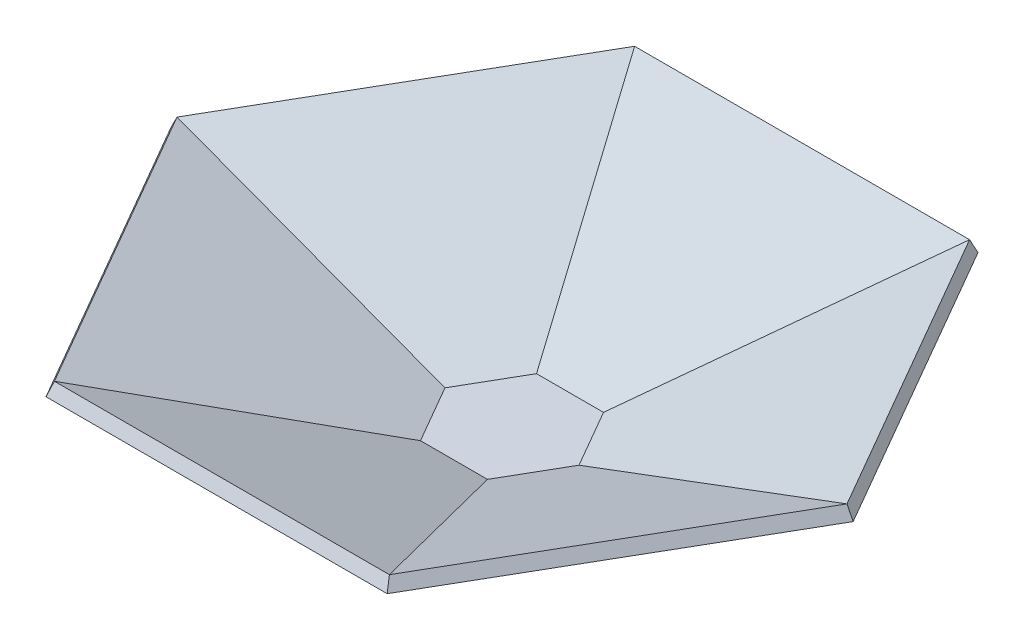
ISO-10303-21;
HEADER;
FILE_DESCRIPTION(('STEP AP214'),'2;1');
FILE_NAME('part.step','',(''),(''),'','','');
FILE_SCHEMA(('AUTOMOTIVE_DESIGN { 1 0 10303 214 1 1 1 1 }'));
ENDSEC;
DATA;
#1=APPLICATION_CONTEXT('core data for automotive mechanical design processes');
#2=APPLICATION_PROTOCOL_DEFINITION('international standard','automotive_design',2000,#1);
#3=PRODUCT_CONTEXT('',#1,'mechanical');
#4=PRODUCT('Part','Part','',(#3));
#5=PRODUCT_RELATED_PRODUCT_CATEGORY('part','',(#4));
#6=PRODUCT_DEFINITION_FORMATION('','',#4);
#7=PRODUCT_DEFINITION_CONTEXT('part definition',#1,'design');
#8=PRODUCT_DEFINITION('design','',#6,#7);
#9=PRODUCT_DEFINITION_SHAPE('','',#8);
#10=(LENGTH_UNIT() NAMED_UNIT(*) SI_UNIT(.MILLI.,.METRE.));
#11=(NAMED_UNIT(*) PLANE_ANGLE_UNIT() SI_UNIT($,.RADIAN.));
#12=(NAMED_UNIT(*) SI_UNIT($,.STERADIAN.) SOLID_ANGLE_UNIT());
#13=UNCERTAINTY_MEASURE_WITH_UNIT(LENGTH_MEASURE(1.E-05),#10,'distance_accuracy_value','');
#14=(GEOMETRIC_REPRESENTATION_CONTEXT(3) GLOBAL_UNCERTAINTY_ASSIGNED_CONTEXT((#13)) GLOBAL_UNIT_ASSIGNED_CONTEXT((#10,
#11,#12)) REPRESENTATION_CONTEXT('',''));
#15=CARTESIAN_POINT('',(0.,0.,0.));
#16=DIRECTION('',(0.,0.,1.));
#17=DIRECTION('',(1.,0.,0.));
#18=AXIS2_PLACEMENT_3D('',#15,#16,#17);
#19=CARTESIAN_POINT('',(-25.0000000000002,15.,-43.3012701892218));
#20=DIRECTION('',(-0.794719414239029,0.397359707119514,-0.458831467741119));
#21=DIRECTION('',(-0.499999999999995,0.,0.866025403784441));
#22=AXIS2_PLACEMENT_3D('',#19,#20,#21);
#23=PLANE('',#22);
#24=DIRECTION('',(-0.447213595499961,-0.894427190999914,0.));
#25=VECTOR('',#24,1.);
#26=CARTESIAN_POINT('',(-50.,15.,3.46944695195361E-13));
#27=LINE('',#26,#25);
#28=CARTESIAN_POINT('',(-50.,15.,3.46944695195361E-13));
#29=VERTEX_POINT('',#28);
#30=CARTESIAN_POINT('',(-50.9176629354823,13.1646741290355,3.56700427543127E-13));
#31=VERTEX_POINT('',#30);
#32=EDGE_CURVE('E11',#29,#31,#27,.T.);
#33=ORIENTED_EDGE('',*,*,#32,.F.);
#34=DIRECTION('',(-0.499999999999995,0.,0.866025403784441));
#35=VECTOR('',#34,1.);
#36=CARTESIAN_POINT('',(-25.0000000000002,15.,-43.3012701892218));
#37=LINE('',#36,#35);
#38=CARTESIAN_POINT('',(-25.0000000000002,15.,-43.3012701892218));
#39=VERTEX_POINT('',#38);
#40=EDGE_CURVE('E236',#39,#29,#37,.T.);
#41=ORIENTED_EDGE('',*,*,#40,.F.);
#42=DIRECTION('',(-0.223606797749995,-0.894427190999898,-0.387298334620774));
#43=VECTOR('',#42,1.);
#44=CARTESIAN_POINT('',(-25.0000000000002,15.,-43.3012701892218));
#45=LINE('',#44,#43);
#46=CARTESIAN_POINT('',(-25.4588314677414,13.1646741290355,-44.0959896034609));
#47=VERTEX_POINT('',#46);
#48=EDGE_CURVE('E48',#39,#47,#45,.T.);
#49=ORIENTED_EDGE('',*,*,#48,.T.);
#50=DIRECTION('',(-0.499999999999995,0.,0.866025403784441));
#51=VECTOR('',#50,1.);
#52=CARTESIAN_POINT('',(-25.6882472016119,13.1646741290355,-43.6986298963413));
#53=LINE('',#52,#51);
#54=EDGE_CURVE('E190',#47,#31,#53,.T.);
#55=ORIENTED_EDGE('',*,*,#54,.T.);
#56=EDGE_LOOP('',(#33,#41,#49,#55));
#57=FACE_BOUND('',#56,.T.);
#58=ADVANCED_FACE('F38',(#57),#23,.T.);
#59=CARTESIAN_POINT('',(24.9999999999999,15.,-43.301270189222));
#60=DIRECTION('',(0.,0.397359707119514,-0.917662935482247));
#61=DIRECTION('',(-1.,0.,0.));
#62=AXIS2_PLACEMENT_3D('',#59,#60,#61);
#63=PLANE('',#62);
#64=ORIENTED_EDGE('',*,*,#48,.F.);
#65=DIRECTION('',(-1.,0.,0.));
#66=VECTOR('',#65,1.);
#67=CARTESIAN_POINT('',(24.9999999999999,15.,-43.301270189222));
#68=LINE('',#67,#66);
#69=CARTESIAN_POINT('',(24.9999999999999,15.,-43.301270189222));
#70=VERTEX_POINT('',#69);
#71=EDGE_CURVE('E140',#70,#39,#68,.T.);
#72=ORIENTED_EDGE('',*,*,#71,.F.);
#73=DIRECTION('',(0.223606797749979,-0.894427190999915,-0.387298334620744));
#74=VECTOR('',#73,1.);
#75=CARTESIAN_POINT('',(24.9999999999999,15.,-43.301270189222));
#76=LINE('',#75,#74);
#77=CARTESIAN_POINT('',(25.458831467741,13.1646741290355,-44.095989603461));
#78=VERTEX_POINT('',#77);
#79=EDGE_CURVE('E134',#70,#78,#76,.T.);
#80=ORIENTED_EDGE('',*,*,#79,.T.);
#81=DIRECTION('',(1.,0.,0.));
#82=VECTOR('',#81,1.);
#83=CARTESIAN_POINT('',(0.,13.1646741290355,-44.095989603461));
#84=LINE('',#83,#82);
#85=EDGE_CURVE('E137',#78,#47,#84,.F.);
#86=ORIENTED_EDGE('',*,*,#85,.T.);
#87=EDGE_LOOP('',(#64,#72,#80,#86));
#88=FACE_BOUND('',#87,.T.);
#89=ADVANCED_FACE('F136',(#88),#63,.T.);
#90=CARTESIAN_POINT('',(50.,15.,0.));
#91=DIRECTION('',(0.794719414239026,0.397359707119513,-0.458831467741124));
#92=DIRECTION('',(-0.500000000000001,0.,-0.866025403784438));
#93=AXIS2_PLACEMENT_3D('',#90,#91,#92);
#94=PLANE('',#93);
#95=ORIENTED_EDGE('',*,*,#79,.F.);
#96=DIRECTION('',(-0.500000000000001,0.,-0.866025403784438));
#97=VECTOR('',#96,1.);
#98=CARTESIAN_POINT('',(50.,15.,0.));
#99=LINE('',#98,#97);
#100=CARTESIAN_POINT('',(50.,15.,0.));
#101=VERTEX_POINT('',#100);
#102=EDGE_CURVE('E225',#101,#70,#99,.T.);
#103=ORIENTED_EDGE('',*,*,#102,.F.);
#104=DIRECTION('',(0.447213595499958,-0.894427190999916,0.));
#105=VECTOR('',#104,1.);
#106=CARTESIAN_POINT('',(50.,15.,0.));
#107=LINE('',#106,#105);
#108=CARTESIAN_POINT('',(50.9176629354823,13.1646741290355,0.));
#109=VERTEX_POINT('',#108);
#110=EDGE_CURVE('E145',#101,#109,#107,.T.);
#111=ORIENTED_EDGE('',*,*,#110,.T.);
#112=DIRECTION('',(-0.500000000000001,0.,-0.866025403784438));
#113=VECTOR('',#112,1.);
#114=CARTESIAN_POINT('',(50.6882472016117,13.1646741290355,-0.397359707119514));
#115=LINE('',#114,#113);
#116=EDGE_CURVE('E159',#109,#78,#115,.T.);
#117=ORIENTED_EDGE('',*,*,#116,.T.);
#118=EDGE_LOOP('',(#95,#103,#111,#117));
#119=FACE_BOUND('',#118,.T.);
#120=ADVANCED_FACE('F160',(#119),#94,.T.);
#121=CARTESIAN_POINT('',(25.0000000000005,15.,43.3012701892216));
#122=DIRECTION('',(0.79471941423903,0.397359707119512,0.458831467741119));
#123=DIRECTION('',(0.499999999999995,0.,-0.866025403784442));
#124=AXIS2_PLACEMENT_3D('',#121,#122,#123);
#125=PLANE('',#124);
#126=ORIENTED_EDGE('',*,*,#110,.F.);
#127=DIRECTION('',(0.499999999999995,0.,-0.866025403784442));
#128=VECTOR('',#127,1.);
#129=CARTESIAN_POINT('',(25.0000000000005,15.,43.3012701892216));
#130=LINE('',#129,#128);
#131=CARTESIAN_POINT('',(25.0000000000005,15.,43.3012701892216));
#132=VERTEX_POINT('',#131);
#133=EDGE_CURVE('E216',#132,#101,#130,.T.);
#134=ORIENTED_EDGE('',*,*,#133,.F.);
#135=DIRECTION('',(0.223606797750047,-0.894427190999855,0.387298334620844));
#136=VECTOR('',#135,1.);
#137=CARTESIAN_POINT('',(25.0000000000005,15.,43.3012701892216));
#138=LINE('',#137,#136);
#139=CARTESIAN_POINT('',(25.4588314677418,13.1646741290356,44.0959896034609));
#140=VERTEX_POINT('',#139);
#141=EDGE_CURVE('E240',#132,#140,#138,.T.);
#142=ORIENTED_EDGE('',*,*,#141,.T.);
#143=DIRECTION('',(0.499999999999995,0.,-0.866025403784442));
#144=VECTOR('',#143,1.);
#145=CARTESIAN_POINT('',(25.6882472016122,13.1646741290355,43.6986298963412));
#146=LINE('',#145,#144);
#147=EDGE_CURVE('E171',#140,#109,#146,.T.);
#148=ORIENTED_EDGE('',*,*,#147,.T.);
#149=EDGE_LOOP('',(#126,#134,#142,#148));
#150=FACE_BOUND('',#149,.T.);
#151=ADVANCED_FACE('F259',(#150),#125,.T.);
#152=CARTESIAN_POINT('',(-24.9999999999996,15.,43.3012701892222));
#153=DIRECTION('',(0.,0.397359707119514,0.917662935482247));
#154=DIRECTION('',(1.,0.,0.));
#155=AXIS2_PLACEMENT_3D('',#152,#153,#154);
#156=PLANE('',#155);
#157=ORIENTED_EDGE('',*,*,#141,.F.);
#158=DIRECTION('',(1.,0.,0.));
#159=VECTOR('',#158,1.);
#160=CARTESIAN_POINT('',(-24.9999999999996,15.,43.3012701892222));
#161=LINE('',#160,#159);
#162=CARTESIAN_POINT('',(-24.9999999999996,15.,43.3012701892222));
#163=VERTEX_POINT('',#162);
#164=EDGE_CURVE('E201',#163,#132,#161,.T.);
#165=ORIENTED_EDGE('',*,*,#164,.F.);
#166=DIRECTION('',(-0.223606797749981,-0.894427190999916,0.387298334620741));
#167=VECTOR('',#166,1.);
#168=CARTESIAN_POINT('',(-24.9999999999996,15.,43.3012701892222));
#169=LINE('',#168,#167);
#170=CARTESIAN_POINT('',(-25.4588314677407,13.1646741290355,44.0959896034612));
#171=VERTEX_POINT('',#170);
#172=EDGE_CURVE('E42',#163,#171,#169,.T.);
#173=ORIENTED_EDGE('',*,*,#172,.T.);
#174=DIRECTION('',(1.,0.,0.));
#175=VECTOR('',#174,1.);
#176=CARTESIAN_POINT('',(0.,13.1646741290356,44.0959896034612));
#177=LINE('',#176,#175);
#178=EDGE_CURVE('E184',#171,#140,#177,.T.);
#179=ORIENTED_EDGE('',*,*,#178,.T.);
#180=EDGE_LOOP('',(#157,#165,#173,#179));
#181=FACE_BOUND('',#180,.T.);
#182=ADVANCED_FACE('F284',(#181),#156,.T.);
#183=CARTESIAN_POINT('',(-50.,15.,3.49148133884313E-13));
#184=DIRECTION('',(-0.794719414239022,0.397359707119514,0.45883146774113));
#185=DIRECTION('',(0.500000000000007,0.,0.866025403784435));
#186=AXIS2_PLACEMENT_3D('',#183,#184,#185);
#187=PLANE('',#186);
#188=DIRECTION('',(0.500000000000007,0.,0.866025403784435));
#189=VECTOR('',#188,1.);
#190=CARTESIAN_POINT('',(-50.,15.,3.49148133884313E-13));
#191=LINE('',#190,#189);
#192=EDGE_CURVE('E197',#29,#163,#191,.T.);
#193=ORIENTED_EDGE('',*,*,#192,.F.);
#194=ORIENTED_EDGE('',*,*,#32,.T.);
#195=DIRECTION('',(0.500000000000007,0.,0.866025403784435));
#196=VECTOR('',#195,1.);
#197=CARTESIAN_POINT('',(-50.6882472016117,13.1646741290355,0.397359707119869));
#198=LINE('',#197,#196);
#199=EDGE_CURVE('E192',#31,#171,#198,.T.);
#200=ORIENTED_EDGE('',*,*,#199,.T.);
#201=ORIENTED_EDGE('',*,*,#172,.F.);
#202=EDGE_LOOP('',(#193,#194,#200,#201));
#203=FACE_BOUND('',#202,.T.);
#204=ADVANCED_FACE('F40',(#203),#187,.T.);
#205=CARTESIAN_POINT('',(0.,-4.99322060780662,2.16212794653026));
#206=DIRECTION('',(0.,0.917662935482247,-0.397359707119514));
#207=DIRECTION('',(0.,0.397359707119514,0.917662935482247));
#208=AXIS2_PLACEMENT_3D('',#205,#206,#207);
#209=PLANE('',#208);
#210=DIRECTION('',(0.468164588784533,0.351123441588392,0.810884854079377));
#211=VECTOR('',#210,1.);
#212=CARTESIAN_POINT('',(0.974704022756725,-5.19842145470277,1.68823688975652));
#213=LINE('',#212,#211);
#214=CARTESIAN_POINT('',(5.23926596236052,-2.,9.07467484117455));
#215=VERTEX_POINT('',#214);
#216=EDGE_CURVE('E188',#215,#140,#213,.T.);
#217=ORIENTED_EDGE('',*,*,#216,.T.);
#218=ORIENTED_EDGE('',*,*,#178,.F.);
#219=DIRECTION('',(-0.468164588784515,0.351123441588392,0.810884854079387));
#220=VECTOR('',#219,1.);
#221=CARTESIAN_POINT('',(-0.974704022756751,-5.19842145470278,1.68823688975652));
#222=LINE('',#221,#220);
#223=CARTESIAN_POINT('',(-5.23926596236039,-2.,9.07467484117465));
#224=VERTEX_POINT('',#223);
#225=EDGE_CURVE('E187',#224,#171,#222,.T.);
#226=ORIENTED_EDGE('',*,*,#225,.F.);
#227=DIRECTION('',(1.,0.,0.));
#228=VECTOR('',#227,1.);
#229=CARTESIAN_POINT('',(0.,-2.,9.0746748411746));
#230=LINE('',#229,#228);
#231=EDGE_CURVE('E112',#224,#215,#230,.T.);
#232=ORIENTED_EDGE('',*,*,#231,.T.);
#233=EDGE_LOOP('',(#217,#218,#226,#232));
#234=FACE_BOUND('',#233,.T.);
#235=ADVANCED_FACE('F268',(#234),#209,.F.);
#236=CARTESIAN_POINT('',(-1.87245772792748,-4.99322060780662,1.08106397326514));
#237=DIRECTION('',(0.344123600805842,0.917662935482247,-0.19867985355976));
#238=DIRECTION('',(-0.936329177569045,0.351123441588391,0.));
#239=AXIS2_PLACEMENT_3D('',#236,#237,#238);
#240=PLANE('',#239);
#241=ORIENTED_EDGE('',*,*,#225,.T.);
#242=ORIENTED_EDGE('',*,*,#199,.F.);
#243=DIRECTION('',(-0.936329177569044,0.351123441588392,0.));
#244=VECTOR('',#243,1.);
#245=CARTESIAN_POINT('',(-1.94940804551354,-5.19842145470278,0.));
#246=LINE('',#245,#244);
#247=CARTESIAN_POINT('',(-10.4785319247209,-2.,1.00911673563117E-13));
#248=VERTEX_POINT('',#247);
#249=EDGE_CURVE('E178',#248,#31,#246,.T.);
#250=ORIENTED_EDGE('',*,*,#249,.F.);
#251=DIRECTION('',(0.500000000000007,0.,0.866025403784435));
#252=VECTOR('',#251,1.);
#253=CARTESIAN_POINT('',(-7.85889894354068,-2.,4.53733742058736));
#254=LINE('',#253,#252);
#255=EDGE_CURVE('E182',#248,#224,#254,.T.);
#256=ORIENTED_EDGE('',*,*,#255,.T.);
#257=EDGE_LOOP('',(#241,#242,#250,#256));
#258=FACE_BOUND('',#257,.T.);
#259=ADVANCED_FACE('F278',(#258),#240,.F.);
#260=CARTESIAN_POINT('',(1.87245772792748,-4.9932206078066,1.08106397326511));
#261=DIRECTION('',(-0.344123600805843,0.917662935482248,-0.198679853559754));
#262=DIRECTION('',(-0.936329177569045,-0.351123441588392,0.));
#263=AXIS2_PLACEMENT_3D('',#260,#261,#262);
#264=PLANE('',#263);
#265=DIRECTION('',(0.936329177569045,0.351123441588392,0.));
#266=VECTOR('',#265,1.);
#267=CARTESIAN_POINT('',(1.94940804551354,-5.19842145470276,0.));
#268=LINE('',#267,#266);
#269=CARTESIAN_POINT('',(10.4785319247209,-2.,0.));
#270=VERTEX_POINT('',#269);
#271=EDGE_CURVE('E179',#270,#109,#268,.T.);
#272=ORIENTED_EDGE('',*,*,#271,.T.);
#273=ORIENTED_EDGE('',*,*,#147,.F.);
#274=ORIENTED_EDGE('',*,*,#216,.F.);
#275=DIRECTION('',(0.499999999999995,0.,-0.866025403784442));
#276=VECTOR('',#275,1.);
#277=CARTESIAN_POINT('',(7.85889894354072,-2.,4.53733742058724));
#278=LINE('',#277,#276);
#279=EDGE_CURVE('E168',#215,#270,#278,.T.);
#280=ORIENTED_EDGE('',*,*,#279,.T.);
#281=EDGE_LOOP('',(#272,#273,#274,#280));
#282=FACE_BOUND('',#281,.T.);
#283=ADVANCED_FACE('F263',(#282),#264,.F.);
#284=CARTESIAN_POINT('',(1.87245772792748,-4.99322060780661,-1.08106397326513));
#285=DIRECTION('',(-0.344123600805843,0.917662935482247,0.198679853559757));
#286=DIRECTION('',(-0.936329177569044,-0.351123441588392,0.));
#287=AXIS2_PLACEMENT_3D('',#284,#285,#286);
#288=PLANE('',#287);
#289=DIRECTION('',(0.468164588784521,0.351123441588392,-0.810884854079384));
#290=VECTOR('',#289,1.);
#291=CARTESIAN_POINT('',(0.974704022756753,-5.19842145470277,-1.68823688975651));
#292=LINE('',#291,#290);
#293=CARTESIAN_POINT('',(5.23926596236043,-2.,-9.07467484117459));
#294=VERTEX_POINT('',#293);
#295=EDGE_CURVE('E153',#294,#78,#292,.T.);
#296=ORIENTED_EDGE('',*,*,#295,.T.);
#297=ORIENTED_EDGE('',*,*,#116,.F.);
#298=ORIENTED_EDGE('',*,*,#271,.F.);
#299=DIRECTION('',(-0.500000000000001,0.,-0.866025403784438));
#300=VECTOR('',#299,1.);
#301=CARTESIAN_POINT('',(7.85889894354068,-2.,-4.53733742058729));
#302=LINE('',#301,#300);
#303=EDGE_CURVE('E164',#270,#294,#302,.T.);
#304=ORIENTED_EDGE('',*,*,#303,.T.);
#305=EDGE_LOOP('',(#296,#297,#298,#304));
#306=FACE_BOUND('',#305,.T.);
#307=ADVANCED_FACE('F167',(#306),#288,.F.);
#308=CARTESIAN_POINT('',(0.,-4.99322060780661,-2.16212794653025));
#309=DIRECTION('',(0.,0.917662935482247,0.397359707119514));
#310=DIRECTION('',(0.,-0.397359707119514,0.917662935482247));
#311=AXIS2_PLACEMENT_3D('',#308,#309,#310);
#312=PLANE('',#311);
#313=DIRECTION('',(-0.468164588784526,0.351123441588392,-0.810884854079381));
#314=VECTOR('',#313,1.);
#315=CARTESIAN_POINT('',(-0.974704022756774,-5.19842145470277,-1.6882368897565));
#316=LINE('',#315,#314);
#317=CARTESIAN_POINT('',(-5.2392659623605,-2.,-9.07467484117455));
#318=VERTEX_POINT('',#317);
#319=EDGE_CURVE('E155',#318,#47,#316,.T.);
#320=ORIENTED_EDGE('',*,*,#319,.T.);
#321=ORIENTED_EDGE('',*,*,#85,.F.);
#322=ORIENTED_EDGE('',*,*,#295,.F.);
#323=DIRECTION('',(-1.,0.,0.));
#324=VECTOR('',#323,1.);
#325=CARTESIAN_POINT('',(0.,-2.,-9.07467484117457));
#326=LINE('',#325,#324);
#327=EDGE_CURVE('E156',#294,#318,#326,.T.);
#328=ORIENTED_EDGE('',*,*,#327,.T.);
#329=EDGE_LOOP('',(#320,#321,#322,#328));
#330=FACE_BOUND('',#329,.T.);
#331=ADVANCED_FACE('F150',(#330),#312,.F.);
#332=CARTESIAN_POINT('',(-1.87245772792749,-4.99322060780661,-1.08106397326512));
#333=DIRECTION('',(0.344123600805844,0.917662935482247,0.198679853559755));
#334=DIRECTION('',(-0.936329177569044,0.351123441588393,0.));
#335=AXIS2_PLACEMENT_3D('',#332,#333,#334);
#336=PLANE('',#335);
#337=ORIENTED_EDGE('',*,*,#249,.T.);
#338=ORIENTED_EDGE('',*,*,#54,.F.);
#339=ORIENTED_EDGE('',*,*,#319,.F.);
#340=DIRECTION('',(-0.499999999999995,0.,0.866025403784441));
#341=VECTOR('',#340,1.);
#342=CARTESIAN_POINT('',(-7.85889894354072,-2.,-4.53733742058724));
#343=LINE('',#342,#341);
#344=EDGE_CURVE('E175',#318,#248,#343,.T.);
#345=ORIENTED_EDGE('',*,*,#344,.T.);
#346=EDGE_LOOP('',(#337,#338,#339,#345));
#347=FACE_BOUND('',#346,.T.);
#348=ADVANCED_FACE('F281',(#347),#336,.F.);
#349=CARTESIAN_POINT('',(0.,-2.,0.));
#350=DIRECTION('',(0.,1.,0.));
#351=DIRECTION('',(0.,0.,1.));
#352=AXIS2_PLACEMENT_3D('',#349,#350,#351);
#353=PLANE('',#352);
#354=ORIENTED_EDGE('',*,*,#279,.F.);
#355=ORIENTED_EDGE('',*,*,#231,.F.);
#356=ORIENTED_EDGE('',*,*,#255,.F.);
#357=ORIENTED_EDGE('',*,*,#344,.F.);
#358=ORIENTED_EDGE('',*,*,#327,.F.);
#359=ORIENTED_EDGE('',*,*,#303,.F.);
#360=EDGE_LOOP('',(#354,#355,#356,#357,#358,#359));
#361=FACE_BOUND('',#360,.T.);
#362=ADVANCED_FACE('F265',(#361),#353,.F.);
#363=CARTESIAN_POINT('',(0.,-3.15789473684213,1.36740853229123));
#364=DIRECTION('',(0.,0.917662935482247,-0.397359707119514));
#365=DIRECTION('',(0.,0.397359707119514,0.917662935482247));
#366=AXIS2_PLACEMENT_3D('',#363,#364,#365);
#367=PLANE('',#366);
#368=DIRECTION('',(0.468164588784534,0.351123441588392,0.810884854079376));
#369=VECTOR('',#368,1.);
#370=CARTESIAN_POINT('',(5.,0.,8.66025403784439));
#371=LINE('',#370,#369);
#372=CARTESIAN_POINT('',(5.00000000000005,0.,8.66025403784436));
#373=VERTEX_POINT('',#372);
#374=EDGE_CURVE('E204',#373,#132,#371,.T.);
#375=ORIENTED_EDGE('',*,*,#374,.F.);
#376=DIRECTION('',(1.,0.,0.));
#377=VECTOR('',#376,1.);
#378=CARTESIAN_POINT('',(-5.,0.,8.66025403784439));
#379=LINE('',#378,#377);
#380=CARTESIAN_POINT('',(-4.99999999999996,0.,8.66025403784441));
#381=VERTEX_POINT('',#380);
#382=EDGE_CURVE('E194',#381,#373,#379,.T.);
#383=ORIENTED_EDGE('',*,*,#382,.F.);
#384=DIRECTION('',(-0.468164588784513,0.351123441588392,0.810884854079389));
#385=VECTOR('',#384,1.);
#386=CARTESIAN_POINT('',(-5.,0.,8.66025403784439));
#387=LINE('',#386,#385);
#388=EDGE_CURVE('E198',#381,#163,#387,.T.);
#389=ORIENTED_EDGE('',*,*,#388,.T.);
#390=ORIENTED_EDGE('',*,*,#164,.T.);
#391=EDGE_LOOP('',(#375,#383,#389,#390));
#392=FACE_BOUND('',#391,.T.);
#393=ADVANCED_FACE('F316',(#392),#367,.T.);
#394=CARTESIAN_POINT('',(-1.18421052631579,-3.15789473684213,0.683704266145625));
#395=DIRECTION('',(0.344123600805842,0.917662935482247,-0.19867985355976));
#396=DIRECTION('',(-0.936329177569045,0.351123441588391,0.));
#397=AXIS2_PLACEMENT_3D('',#394,#395,#396);
#398=PLANE('',#397);
#399=ORIENTED_EDGE('',*,*,#388,.F.);
#400=DIRECTION('',(0.5,0.,0.866025403784438));
#401=VECTOR('',#400,1.);
#402=CARTESIAN_POINT('',(-10.,0.,0.));
#403=LINE('',#402,#401);
#404=CARTESIAN_POINT('',(-10.,0.,0.));
#405=VERTEX_POINT('',#404);
#406=EDGE_CURVE('E207',#405,#381,#403,.T.);
#407=ORIENTED_EDGE('',*,*,#406,.F.);
#408=DIRECTION('',(-0.936329177569045,0.351123441588392,0.));
#409=VECTOR('',#408,1.);
#410=CARTESIAN_POINT('',(-10.,0.,0.));
#411=LINE('',#410,#409);
#412=EDGE_CURVE('E231',#405,#29,#411,.T.);
#413=ORIENTED_EDGE('',*,*,#412,.T.);
#414=ORIENTED_EDGE('',*,*,#192,.T.);
#415=EDGE_LOOP('',(#399,#407,#413,#414));
#416=FACE_BOUND('',#415,.T.);
#417=ADVANCED_FACE('F313',(#416),#398,.T.);
#418=CARTESIAN_POINT('',(1.18421052631579,-3.15789473684211,0.683704266145601));
#419=DIRECTION('',(-0.344123600805843,0.917662935482248,-0.198679853559754));
#420=DIRECTION('',(-0.936329177569045,-0.351123441588392,0.));
#421=AXIS2_PLACEMENT_3D('',#418,#419,#420);
#422=PLANE('',#421);
#423=DIRECTION('',(0.936329177569045,0.351123441588392,0.));
#424=VECTOR('',#423,1.);
#425=CARTESIAN_POINT('',(10.,0.,0.));
#426=LINE('',#425,#424);
#427=CARTESIAN_POINT('',(10.,0.,0.));
#428=VERTEX_POINT('',#427);
#429=EDGE_CURVE('E209',#428,#101,#426,.T.);
#430=ORIENTED_EDGE('',*,*,#429,.F.);
#431=DIRECTION('',(0.5,0.,-0.866025403784439));
#432=VECTOR('',#431,1.);
#433=CARTESIAN_POINT('',(5.,0.,8.66025403784439));
#434=LINE('',#433,#432);
#435=EDGE_CURVE('E212',#373,#428,#434,.T.);
#436=ORIENTED_EDGE('',*,*,#435,.F.);
#437=ORIENTED_EDGE('',*,*,#374,.T.);
#438=ORIENTED_EDGE('',*,*,#133,.T.);
#439=EDGE_LOOP('',(#430,#436,#437,#438));
#440=FACE_BOUND('',#439,.T.);
#441=ADVANCED_FACE('F256',(#440),#422,.T.);
#442=CARTESIAN_POINT('',(1.18421052631579,-3.15789473684211,-0.683704266145613));
#443=DIRECTION('',(-0.344123600805843,0.917662935482247,0.198679853559757));
#444=DIRECTION('',(-0.936329177569044,-0.351123441588392,0.));
#445=AXIS2_PLACEMENT_3D('',#442,#443,#444);
#446=PLANE('',#445);
#447=DIRECTION('',(0.46816458878452,0.351123441588392,-0.810884854079384));
#448=VECTOR('',#447,1.);
#449=CARTESIAN_POINT('',(5.,0.,-8.66025403784439));
#450=LINE('',#449,#448);
#451=CARTESIAN_POINT('',(4.99999999999999,0.,-8.66025403784439));
#452=VERTEX_POINT('',#451);
#453=EDGE_CURVE('E215',#452,#70,#450,.T.);
#454=ORIENTED_EDGE('',*,*,#453,.F.);
#455=DIRECTION('',(-0.5,0.,-0.866025403784438));
#456=VECTOR('',#455,1.);
#457=CARTESIAN_POINT('',(10.,0.,0.));
#458=LINE('',#457,#456);
#459=EDGE_CURVE('E221',#428,#452,#458,.T.);
#460=ORIENTED_EDGE('',*,*,#459,.F.);
#461=ORIENTED_EDGE('',*,*,#429,.T.);
#462=ORIENTED_EDGE('',*,*,#102,.T.);
#463=EDGE_LOOP('',(#454,#460,#461,#462));
#464=FACE_BOUND('',#463,.T.);
#465=ADVANCED_FACE('F252',(#464),#446,.T.);
#466=CARTESIAN_POINT('',(0.,-3.15789473684212,-1.36740853229123));
#467=DIRECTION('',(0.,0.917662935482247,0.397359707119514));
#468=DIRECTION('',(0.,-0.397359707119514,0.917662935482247));
#469=AXIS2_PLACEMENT_3D('',#466,#467,#468);
#470=PLANE('',#469);
#471=DIRECTION('',(-0.468164588784527,0.351123441588392,-0.81088485407938));
#472=VECTOR('',#471,1.);
#473=CARTESIAN_POINT('',(-5.,0.,-8.66025403784439));
#474=LINE('',#473,#472);
#475=CARTESIAN_POINT('',(-5.00000000000002,0.,-8.66025403784438));
#476=VERTEX_POINT('',#475);
#477=EDGE_CURVE('E224',#476,#39,#474,.T.);
#478=ORIENTED_EDGE('',*,*,#477,.F.);
#479=DIRECTION('',(-1.,0.,0.));
#480=VECTOR('',#479,1.);
#481=CARTESIAN_POINT('',(5.,0.,-8.66025403784439));
#482=LINE('',#481,#480);
#483=EDGE_CURVE('E229',#452,#476,#482,.T.);
#484=ORIENTED_EDGE('',*,*,#483,.F.);
#485=ORIENTED_EDGE('',*,*,#453,.T.);
#486=ORIENTED_EDGE('',*,*,#71,.T.);
#487=EDGE_LOOP('',(#478,#484,#485,#486));
#488=FACE_BOUND('',#487,.T.);
#489=ADVANCED_FACE('F249',(#488),#470,.T.);
#490=CARTESIAN_POINT('',(-1.1842105263158,-3.15789473684212,-0.683704266145606));
#491=DIRECTION('',(0.344123600805844,0.917662935482247,0.198679853559755));
#492=DIRECTION('',(-0.936329177569044,0.351123441588393,0.));
#493=AXIS2_PLACEMENT_3D('',#490,#491,#492);
#494=PLANE('',#493);
#495=ORIENTED_EDGE('',*,*,#412,.F.);
#496=DIRECTION('',(-0.5,0.,0.866025403784439));
#497=VECTOR('',#496,1.);
#498=CARTESIAN_POINT('',(-5.,0.,-8.66025403784439));
#499=LINE('',#498,#497);
#500=EDGE_CURVE('E100',#476,#405,#499,.T.);
#501=ORIENTED_EDGE('',*,*,#500,.F.);
#502=ORIENTED_EDGE('',*,*,#477,.T.);
#503=ORIENTED_EDGE('',*,*,#40,.T.);
#504=EDGE_LOOP('',(#495,#501,#502,#503));
#505=FACE_BOUND('',#504,.T.);
#506=ADVANCED_FACE('F247',(#505),#494,.T.);
#507=CARTESIAN_POINT('',(0.,0.,0.));
#508=DIRECTION('',(0.,1.,0.));
#509=DIRECTION('',(0.,0.,1.));
#510=AXIS2_PLACEMENT_3D('',#507,#508,#509);
#511=PLANE('',#510);
#512=ORIENTED_EDGE('',*,*,#435,.T.);
#513=ORIENTED_EDGE('',*,*,#459,.T.);
#514=ORIENTED_EDGE('',*,*,#483,.T.);
#515=ORIENTED_EDGE('',*,*,#500,.T.);
#516=ORIENTED_EDGE('',*,*,#406,.T.);
#517=ORIENTED_EDGE('',*,*,#382,.T.);
#518=EDGE_LOOP('',(#512,#513,#514,#515,#516,#517));
#519=FACE_BOUND('',#518,.T.);
#520=ADVANCED_FACE('F302',(#519),#511,.T.);
#521=CLOSED_SHELL('',(#58,#89,#120,#151,#182,#204,#235,#259,#283,#307,#331,#348,#362,#393,#417,
#441,#465,#489,#506,#520));
#522=MANIFOLD_SOLID_BREP('B2',#521);
#523=ADVANCED_BREP_SHAPE_REPRESENTATION('',(#18,#522),#14);
#524=SHAPE_DEFINITION_REPRESENTATION(#9,#523);
ENDSEC;
END-ISO-10303-21;
